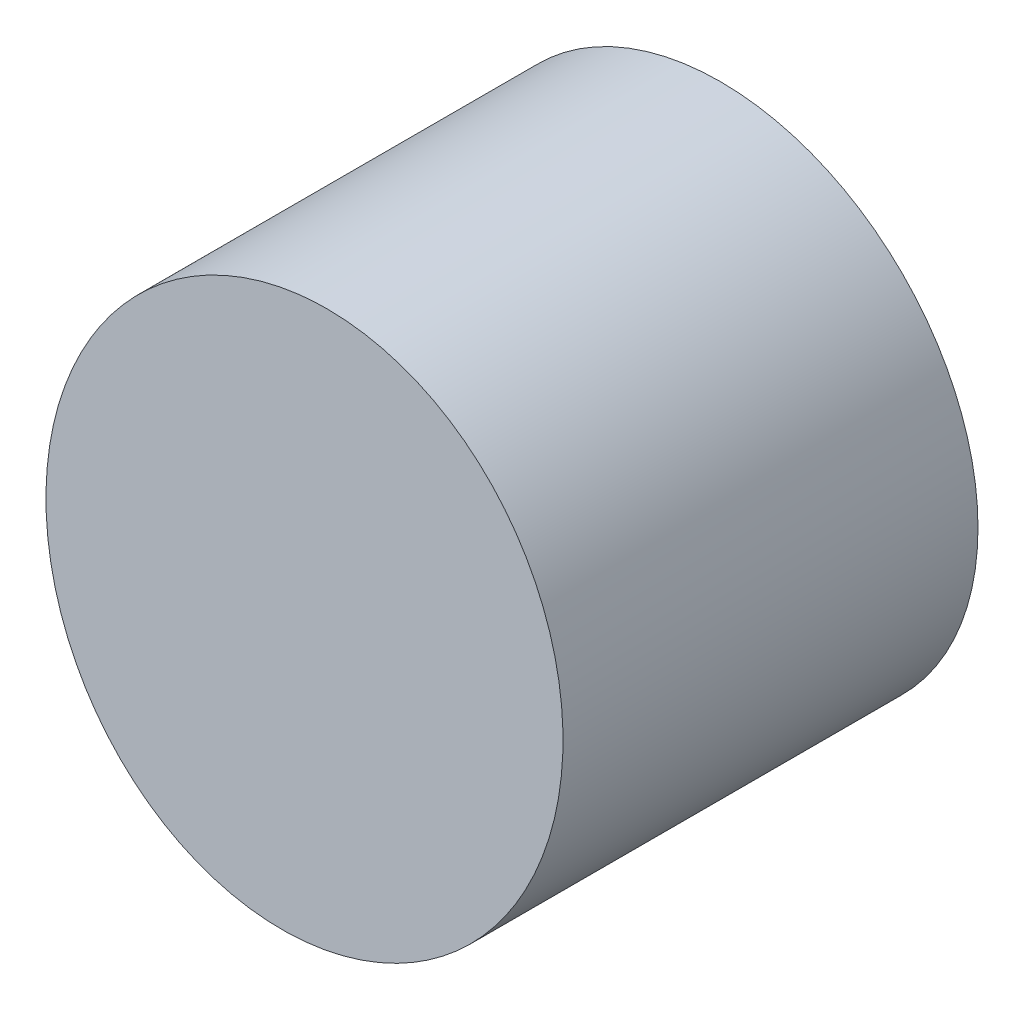
ISO-10303-21;
HEADER;
FILE_DESCRIPTION(('STEP AP214'),'2;1');
FILE_NAME('part.step','',(''),(''),'','','');
FILE_SCHEMA(('AUTOMOTIVE_DESIGN { 1 0 10303 214 1 1 1 1 }'));
ENDSEC;
DATA;
#1=APPLICATION_CONTEXT('core data for automotive mechanical design processes');
#2=APPLICATION_PROTOCOL_DEFINITION('international standard','automotive_design',2000,#1);
#3=PRODUCT_CONTEXT('',#1,'mechanical');
#4=PRODUCT('Part','Part','',(#3));
#5=PRODUCT_RELATED_PRODUCT_CATEGORY('part','',(#4));
#6=PRODUCT_DEFINITION_FORMATION('','',#4);
#7=PRODUCT_DEFINITION_CONTEXT('part definition',#1,'design');
#8=PRODUCT_DEFINITION('design','',#6,#7);
#9=PRODUCT_DEFINITION_SHAPE('','',#8);
#10=(LENGTH_UNIT() NAMED_UNIT(*) SI_UNIT(.MILLI.,.METRE.));
#11=(NAMED_UNIT(*) PLANE_ANGLE_UNIT() SI_UNIT($,.RADIAN.));
#12=(NAMED_UNIT(*) SI_UNIT($,.STERADIAN.) SOLID_ANGLE_UNIT());
#13=UNCERTAINTY_MEASURE_WITH_UNIT(LENGTH_MEASURE(1.E-05),#10,'distance_accuracy_value','');
#14=(GEOMETRIC_REPRESENTATION_CONTEXT(3) GLOBAL_UNCERTAINTY_ASSIGNED_CONTEXT((#13)) GLOBAL_UNIT_ASSIGNED_CONTEXT((#10,
#11,#12)) REPRESENTATION_CONTEXT('',''));
#15=CARTESIAN_POINT('',(0.,0.,0.));
#16=DIRECTION('',(0.,0.,1.));
#17=DIRECTION('',(1.,0.,0.));
#18=AXIS2_PLACEMENT_3D('',#15,#16,#17);
#19=CARTESIAN_POINT('',(0.,0.,0.));
#20=DIRECTION('',(0.,0.,1.));
#21=DIRECTION('',(1.,0.,0.));
#22=AXIS2_PLACEMENT_3D('',#19,#20,#21);
#23=PLANE('',#22);
#24=CARTESIAN_POINT('',(0.,0.,0.));
#25=DIRECTION('',(0.,0.,1.));
#26=DIRECTION('',(1.,0.,0.));
#27=AXIS2_PLACEMENT_3D('',#24,#25,#26);
#28=CIRCLE('',#27,5.);
#29=CARTESIAN_POINT('',(5.,0.,0.));
#30=VERTEX_POINT('',#29);
#31=EDGE_CURVE('E44',#30,#30,#28,.T.);
#32=ORIENTED_EDGE('',*,*,#31,.F.);
#33=EDGE_LOOP('',(#32));
#34=FACE_BOUND('',#33,.T.);
#35=ADVANCED_FACE('F37',(#34),#23,.F.);
#36=CARTESIAN_POINT('',(0.,0.,22.2443953564601));
#37=DIRECTION('',(0.,0.,-1.));
#38=DIRECTION('',(-1.,0.,0.));
#39=AXIS2_PLACEMENT_3D('',#36,#37,#38);
#40=CYLINDRICAL_SURFACE('',#39,5.);
#41=CARTESIAN_POINT('',(0.,0.,8.07524940242981));
#42=DIRECTION('',(0.,-0.0871557427476512,-0.996194698091746));
#43=DIRECTION('',(0.,0.996194698091746,-0.0871557427476513));
#44=AXIS2_PLACEMENT_3D('',#41,#42,#43);
#45=ELLIPSE('',#44,5.01909918771674,5.);
#46=CARTESIAN_POINT('',(0.,5.,7.63780608480022));
#47=VERTEX_POINT('',#46);
#48=EDGE_CURVE('E10',#47,#47,#45,.T.);
#49=ORIENTED_EDGE('',*,*,#48,.T.);
#50=EDGE_LOOP('',(#49));
#51=FACE_BOUND('',#50,.T.);
#52=ORIENTED_EDGE('',*,*,#31,.T.);
#53=EDGE_LOOP('',(#52));
#54=FACE_BOUND('',#53,.T.);
#55=ADVANCED_FACE('F39',(#51,#54),#40,.T.);
#56=CARTESIAN_POINT('',(-12.,-22.,9.99999999999998));
#57=DIRECTION('',(0.,-0.0871557427476512,-0.996194698091746));
#58=DIRECTION('',(0.,0.996194698091746,-0.0871557427476513));
#59=AXIS2_PLACEMENT_3D('',#56,#57,#58);
#60=PLANE('',#59);
#61=ORIENTED_EDGE('',*,*,#48,.F.);
#62=EDGE_LOOP('',(#61));
#63=FACE_BOUND('',#62,.T.);
#64=ADVANCED_FACE('F55',(#63),#60,.F.);
#65=CLOSED_SHELL('',(#35,#55,#64));
#66=MANIFOLD_SOLID_BREP('B2',#65);
#67=ADVANCED_BREP_SHAPE_REPRESENTATION('',(#18,#66),#14);
#68=SHAPE_DEFINITION_REPRESENTATION(#9,#67);
ENDSEC;
END-ISO-10303-21;
